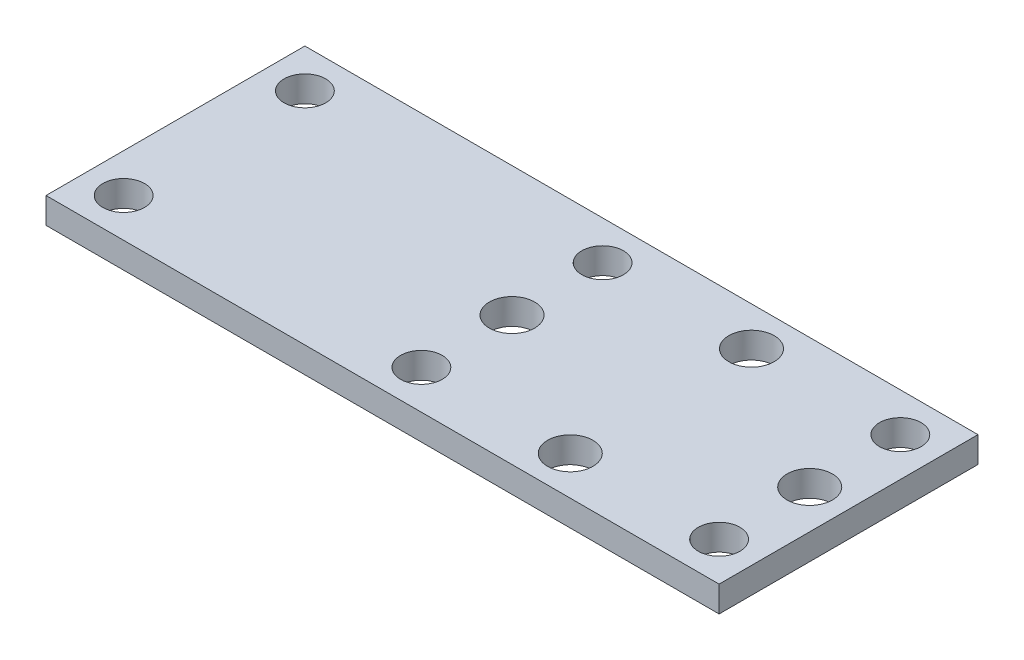
ISO-10303-21;
HEADER;
FILE_DESCRIPTION(('STEP AP214'),'2;1');
FILE_NAME('part.step','',(''),(''),'','','');
FILE_SCHEMA(('AUTOMOTIVE_DESIGN { 1 0 10303 214 1 1 1 1 }'));
ENDSEC;
DATA;
#1=APPLICATION_CONTEXT('core data for automotive mechanical design processes');
#2=APPLICATION_PROTOCOL_DEFINITION('international standard','automotive_design',2000,#1);
#3=PRODUCT_CONTEXT('',#1,'mechanical');
#4=PRODUCT('Part','Part','',(#3));
#5=PRODUCT_RELATED_PRODUCT_CATEGORY('part','',(#4));
#6=PRODUCT_DEFINITION_FORMATION('','',#4);
#7=PRODUCT_DEFINITION_CONTEXT('part definition',#1,'design');
#8=PRODUCT_DEFINITION('design','',#6,#7);
#9=PRODUCT_DEFINITION_SHAPE('','',#8);
#10=(LENGTH_UNIT() NAMED_UNIT(*) SI_UNIT(.MILLI.,.METRE.));
#11=(NAMED_UNIT(*) PLANE_ANGLE_UNIT() SI_UNIT($,.RADIAN.));
#12=(NAMED_UNIT(*) SI_UNIT($,.STERADIAN.) SOLID_ANGLE_UNIT());
#13=UNCERTAINTY_MEASURE_WITH_UNIT(LENGTH_MEASURE(1.E-05),#10,'distance_accuracy_value','');
#14=(GEOMETRIC_REPRESENTATION_CONTEXT(3) GLOBAL_UNCERTAINTY_ASSIGNED_CONTEXT((#13)) GLOBAL_UNIT_ASSIGNED_CONTEXT((#10,
#11,#12)) REPRESENTATION_CONTEXT('',''));
#15=CARTESIAN_POINT('',(0.,0.,0.));
#16=DIRECTION('',(0.,0.,1.));
#17=DIRECTION('',(1.,0.,0.));
#18=AXIS2_PLACEMENT_3D('',#15,#16,#17);
#19=CARTESIAN_POINT('',(0.,-1.5875,0.));
#20=DIRECTION('',(0.,-1.,0.));
#21=DIRECTION('',(0.,0.,-1.));
#22=AXIS2_PLACEMENT_3D('',#19,#20,#21);
#23=PLANE('',#22);
#24=CARTESIAN_POINT('',(0.,-1.5875,0.));
#25=DIRECTION('',(0.,-1.,0.));
#26=DIRECTION('',(0.,0.,-1.));
#27=AXIS2_PLACEMENT_3D('',#24,#25,#26);
#28=CIRCLE('',#27,2.77876);
#29=CARTESIAN_POINT('',(0.,-1.5875,-2.77876));
#30=VERTEX_POINT('',#29);
#31=EDGE_CURVE('E36',#30,#30,#28,.T.);
#32=ORIENTED_EDGE('',*,*,#31,.F.);
#33=EDGE_LOOP('',(#32));
#34=FACE_BOUND('',#33,.T.);
#35=CARTESIAN_POINT('',(18.25625,-1.5875,-11.1125));
#36=DIRECTION('',(0.,-1.,0.));
#37=DIRECTION('',(0.,0.,-1.));
#38=AXIS2_PLACEMENT_3D('',#35,#36,#37);
#39=CIRCLE('',#38,2.77876);
#40=CARTESIAN_POINT('',(18.25625,-1.5875,-13.89126));
#41=VERTEX_POINT('',#40);
#42=EDGE_CURVE('E113',#41,#41,#39,.T.);
#43=ORIENTED_EDGE('',*,*,#42,.F.);
#44=EDGE_LOOP('',(#43));
#45=FACE_BOUND('',#44,.T.);
#46=CARTESIAN_POINT('',(-36.5125,-1.5875,-11.1125));
#47=DIRECTION('',(0.,1.,0.));
#48=DIRECTION('',(0.,0.,1.));
#49=AXIS2_PLACEMENT_3D('',#46,#47,#48);
#50=CIRCLE('',#49,2.5527);
#51=CARTESIAN_POINT('',(-36.5125,-1.5875,-8.5598));
#52=VERTEX_POINT('',#51);
#53=EDGE_CURVE('E135',#52,#52,#50,.T.);
#54=ORIENTED_EDGE('',*,*,#53,.T.);
#55=EDGE_LOOP('',(#54));
#56=FACE_BOUND('',#55,.T.);
#57=CARTESIAN_POINT('',(36.5125,-1.5875,-11.1125));
#58=DIRECTION('',(0.,1.,0.));
#59=DIRECTION('',(0.,0.,1.));
#60=AXIS2_PLACEMENT_3D('',#57,#58,#59);
#61=CIRCLE('',#60,2.5527);
#62=CARTESIAN_POINT('',(36.5125,-1.5875,-8.5598));
#63=VERTEX_POINT('',#62);
#64=EDGE_CURVE('E141',#63,#63,#61,.T.);
#65=ORIENTED_EDGE('',*,*,#64,.T.);
#66=EDGE_LOOP('',(#65));
#67=FACE_BOUND('',#66,.T.);
#68=CARTESIAN_POINT('',(36.5125,-1.5875,11.1125));
#69=DIRECTION('',(0.,1.,0.));
#70=DIRECTION('',(0.,0.,1.));
#71=AXIS2_PLACEMENT_3D('',#68,#69,#70);
#72=CIRCLE('',#71,2.5527);
#73=CARTESIAN_POINT('',(36.5125,-1.5875,13.6652));
#74=VERTEX_POINT('',#73);
#75=EDGE_CURVE('E147',#74,#74,#72,.T.);
#76=ORIENTED_EDGE('',*,*,#75,.T.);
#77=EDGE_LOOP('',(#76));
#78=FACE_BOUND('',#77,.T.);
#79=CARTESIAN_POINT('',(-36.5125,-1.5875,11.1125));
#80=DIRECTION('',(0.,1.,0.));
#81=DIRECTION('',(0.,0.,1.));
#82=AXIS2_PLACEMENT_3D('',#79,#80,#81);
#83=CIRCLE('',#82,2.5527);
#84=CARTESIAN_POINT('',(-36.5125,-1.5875,13.6652));
#85=VERTEX_POINT('',#84);
#86=EDGE_CURVE('E153',#85,#85,#83,.T.);
#87=ORIENTED_EDGE('',*,*,#86,.T.);
#88=EDGE_LOOP('',(#87));
#89=FACE_BOUND('',#88,.T.);
#90=CARTESIAN_POINT('',(0.,-1.5875,11.1125));
#91=DIRECTION('',(0.,1.,0.));
#92=DIRECTION('',(0.,0.,1.));
#93=AXIS2_PLACEMENT_3D('',#90,#91,#92);
#94=CIRCLE('',#93,2.5527);
#95=CARTESIAN_POINT('',(0.,-1.5875,13.6652));
#96=VERTEX_POINT('',#95);
#97=EDGE_CURVE('E159',#96,#96,#94,.T.);
#98=ORIENTED_EDGE('',*,*,#97,.T.);
#99=EDGE_LOOP('',(#98));
#100=FACE_BOUND('',#99,.T.);
#101=CARTESIAN_POINT('',(0.,-1.5875,-11.1125));
#102=DIRECTION('',(0.,1.,0.));
#103=DIRECTION('',(0.,0.,1.));
#104=AXIS2_PLACEMENT_3D('',#101,#102,#103);
#105=CIRCLE('',#104,2.5527);
#106=CARTESIAN_POINT('',(0.,-1.5875,-8.5598));
#107=VERTEX_POINT('',#106);
#108=EDGE_CURVE('E102',#107,#107,#105,.T.);
#109=ORIENTED_EDGE('',*,*,#108,.T.);
#110=EDGE_LOOP('',(#109));
#111=FACE_BOUND('',#110,.T.);
#112=DIRECTION('',(0.,0.,-1.));
#113=VECTOR('',#112,1.);
#114=CARTESIAN_POINT('',(41.275,-1.5875,15.875));
#115=LINE('',#114,#113);
#116=CARTESIAN_POINT('',(41.275,-1.5875,15.875));
#117=VERTEX_POINT('',#116);
#118=CARTESIAN_POINT('',(41.275,-1.5875,-15.875));
#119=VERTEX_POINT('',#118);
#120=EDGE_CURVE('E99',#117,#119,#115,.T.);
#121=ORIENTED_EDGE('',*,*,#120,.F.);
#122=DIRECTION('',(1.,0.,0.));
#123=VECTOR('',#122,1.);
#124=CARTESIAN_POINT('',(-41.275,-1.5875,15.875));
#125=LINE('',#124,#123);
#126=CARTESIAN_POINT('',(-41.275,-1.5875,15.875));
#127=VERTEX_POINT('',#126);
#128=EDGE_CURVE('E74',#127,#117,#125,.T.);
#129=ORIENTED_EDGE('',*,*,#128,.F.);
#130=DIRECTION('',(0.,0.,1.));
#131=VECTOR('',#130,1.);
#132=CARTESIAN_POINT('',(-41.275,-1.5875,15.875));
#133=LINE('',#132,#131);
#134=CARTESIAN_POINT('',(-41.275,-1.5875,-15.875));
#135=VERTEX_POINT('',#134);
#136=EDGE_CURVE('E68',#135,#127,#133,.T.);
#137=ORIENTED_EDGE('',*,*,#136,.F.);
#138=DIRECTION('',(-1.,0.,0.));
#139=VECTOR('',#138,1.);
#140=CARTESIAN_POINT('',(-41.275,-1.5875,-15.875));
#141=LINE('',#140,#139);
#142=EDGE_CURVE('E90',#119,#135,#141,.T.);
#143=ORIENTED_EDGE('',*,*,#142,.F.);
#144=EDGE_LOOP('',(#121,#129,#137,#143));
#145=FACE_BOUND('',#144,.T.);
#146=CARTESIAN_POINT('',(18.25625,-1.5875,11.1125));
#147=DIRECTION('',(0.,-1.,0.));
#148=DIRECTION('',(0.,0.,-1.));
#149=AXIS2_PLACEMENT_3D('',#146,#147,#148);
#150=CIRCLE('',#149,2.77876);
#151=CARTESIAN_POINT('',(18.25625,-1.5875,8.33374));
#152=VERTEX_POINT('',#151);
#153=EDGE_CURVE('E108',#152,#152,#150,.T.);
#154=ORIENTED_EDGE('',*,*,#153,.F.);
#155=EDGE_LOOP('',(#154));
#156=FACE_BOUND('',#155,.T.);
#157=CARTESIAN_POINT('',(36.5125,-1.5875,0.));
#158=DIRECTION('',(0.,-1.,0.));
#159=DIRECTION('',(0.,0.,-1.));
#160=AXIS2_PLACEMENT_3D('',#157,#158,#159);
#161=CIRCLE('',#160,2.77876);
#162=CARTESIAN_POINT('',(36.5125,-1.5875,-2.77876));
#163=VERTEX_POINT('',#162);
#164=EDGE_CURVE('E116',#163,#163,#161,.T.);
#165=ORIENTED_EDGE('',*,*,#164,.F.);
#166=EDGE_LOOP('',(#165));
#167=FACE_BOUND('',#166,.T.);
#168=ADVANCED_FACE('F32',(#34,#45,#56,#67,#78,#89,#100,#111,#145,#156,#167),#23,.T.);
#169=CARTESIAN_POINT('',(41.275,1.5875,15.875));
#170=DIRECTION('',(-1.,0.,0.));
#171=DIRECTION('',(0.,0.,1.));
#172=AXIS2_PLACEMENT_3D('',#169,#170,#171);
#173=PLANE('',#172);
#174=ORIENTED_EDGE('',*,*,#120,.T.);
#175=DIRECTION('',(0.,-1.,0.));
#176=VECTOR('',#175,1.);
#177=CARTESIAN_POINT('',(41.275,1.5875,-15.875));
#178=LINE('',#177,#176);
#179=CARTESIAN_POINT('',(41.275,1.5875,-15.875));
#180=VERTEX_POINT('',#179);
#181=EDGE_CURVE('E11',#180,#119,#178,.T.);
#182=ORIENTED_EDGE('',*,*,#181,.F.);
#183=DIRECTION('',(0.,0.,-1.));
#184=VECTOR('',#183,1.);
#185=CARTESIAN_POINT('',(41.275,1.5875,15.875));
#186=LINE('',#185,#184);
#187=CARTESIAN_POINT('',(41.275,1.5875,15.875));
#188=VERTEX_POINT('',#187);
#189=EDGE_CURVE('E86',#188,#180,#186,.T.);
#190=ORIENTED_EDGE('',*,*,#189,.F.);
#191=DIRECTION('',(0.,-1.,0.));
#192=VECTOR('',#191,1.);
#193=CARTESIAN_POINT('',(41.275,1.5875,15.875));
#194=LINE('',#193,#192);
#195=EDGE_CURVE('E95',#188,#117,#194,.T.);
#196=ORIENTED_EDGE('',*,*,#195,.T.);
#197=EDGE_LOOP('',(#174,#182,#190,#196));
#198=FACE_BOUND('',#197,.T.);
#199=ADVANCED_FACE('F34',(#198),#173,.F.);
#200=CARTESIAN_POINT('',(-41.275,1.5875,-15.875));
#201=DIRECTION('',(0.,0.,1.));
#202=DIRECTION('',(1.,0.,0.));
#203=AXIS2_PLACEMENT_3D('',#200,#201,#202);
#204=PLANE('',#203);
#205=ORIENTED_EDGE('',*,*,#142,.T.);
#206=DIRECTION('',(0.,-1.,0.));
#207=VECTOR('',#206,1.);
#208=CARTESIAN_POINT('',(-41.275,1.5875,-15.875));
#209=LINE('',#208,#207);
#210=CARTESIAN_POINT('',(-41.275,1.5875,-15.875));
#211=VERTEX_POINT('',#210);
#212=EDGE_CURVE('E42',#211,#135,#209,.T.);
#213=ORIENTED_EDGE('',*,*,#212,.F.);
#214=DIRECTION('',(-1.,0.,0.));
#215=VECTOR('',#214,1.);
#216=CARTESIAN_POINT('',(-41.275,1.5875,-15.875));
#217=LINE('',#216,#215);
#218=EDGE_CURVE('E81',#180,#211,#217,.T.);
#219=ORIENTED_EDGE('',*,*,#218,.F.);
#220=ORIENTED_EDGE('',*,*,#181,.T.);
#221=EDGE_LOOP('',(#205,#213,#219,#220));
#222=FACE_BOUND('',#221,.T.);
#223=ADVANCED_FACE('F89',(#222),#204,.F.);
#224=CARTESIAN_POINT('',(-41.275,1.5875,15.875));
#225=DIRECTION('',(1.,0.,0.));
#226=DIRECTION('',(0.,0.,-1.));
#227=AXIS2_PLACEMENT_3D('',#224,#225,#226);
#228=PLANE('',#227);
#229=ORIENTED_EDGE('',*,*,#136,.T.);
#230=DIRECTION('',(0.,-1.,0.));
#231=VECTOR('',#230,1.);
#232=CARTESIAN_POINT('',(-41.275,1.5875,15.875));
#233=LINE('',#232,#231);
#234=CARTESIAN_POINT('',(-41.275,1.5875,15.875));
#235=VERTEX_POINT('',#234);
#236=EDGE_CURVE('E91',#235,#127,#233,.T.);
#237=ORIENTED_EDGE('',*,*,#236,.F.);
#238=DIRECTION('',(0.,0.,1.));
#239=VECTOR('',#238,1.);
#240=CARTESIAN_POINT('',(-41.275,1.5875,15.875));
#241=LINE('',#240,#239);
#242=EDGE_CURVE('E84',#211,#235,#241,.T.);
#243=ORIENTED_EDGE('',*,*,#242,.F.);
#244=ORIENTED_EDGE('',*,*,#212,.T.);
#245=EDGE_LOOP('',(#229,#237,#243,#244));
#246=FACE_BOUND('',#245,.T.);
#247=ADVANCED_FACE('F93',(#246),#228,.F.);
#248=CARTESIAN_POINT('',(-41.275,1.5875,15.875));
#249=DIRECTION('',(0.,0.,-1.));
#250=DIRECTION('',(-1.,0.,0.));
#251=AXIS2_PLACEMENT_3D('',#248,#249,#250);
#252=PLANE('',#251);
#253=ORIENTED_EDGE('',*,*,#128,.T.);
#254=ORIENTED_EDGE('',*,*,#195,.F.);
#255=DIRECTION('',(1.,0.,0.));
#256=VECTOR('',#255,1.);
#257=CARTESIAN_POINT('',(-41.275,1.5875,15.875));
#258=LINE('',#257,#256);
#259=EDGE_CURVE('E51',#235,#188,#258,.T.);
#260=ORIENTED_EDGE('',*,*,#259,.F.);
#261=ORIENTED_EDGE('',*,*,#236,.T.);
#262=EDGE_LOOP('',(#253,#254,#260,#261));
#263=FACE_BOUND('',#262,.T.);
#264=ADVANCED_FACE('F178',(#263),#252,.F.);
#265=CARTESIAN_POINT('',(0.,1.5875,0.));
#266=DIRECTION('',(0.,-1.,0.));
#267=DIRECTION('',(0.,0.,-1.));
#268=AXIS2_PLACEMENT_3D('',#265,#266,#267);
#269=PLANE('',#268);
#270=CARTESIAN_POINT('',(0.,1.5875,0.));
#271=DIRECTION('',(0.,1.,0.));
#272=DIRECTION('',(0.,0.,1.));
#273=AXIS2_PLACEMENT_3D('',#270,#271,#272);
#274=CIRCLE('',#273,2.77876);
#275=CARTESIAN_POINT('',(0.,1.5875,2.77876));
#276=VERTEX_POINT('',#275);
#277=EDGE_CURVE('E128',#276,#276,#274,.T.);
#278=ORIENTED_EDGE('',*,*,#277,.F.);
#279=EDGE_LOOP('',(#278));
#280=FACE_BOUND('',#279,.T.);
#281=CARTESIAN_POINT('',(36.5125,1.5875,0.));
#282=DIRECTION('',(0.,1.,0.));
#283=DIRECTION('',(0.,0.,1.));
#284=AXIS2_PLACEMENT_3D('',#281,#282,#283);
#285=CIRCLE('',#284,2.77876);
#286=CARTESIAN_POINT('',(36.5125,1.5875,2.77876));
#287=VERTEX_POINT('',#286);
#288=EDGE_CURVE('E118',#287,#287,#285,.T.);
#289=ORIENTED_EDGE('',*,*,#288,.F.);
#290=EDGE_LOOP('',(#289));
#291=FACE_BOUND('',#290,.T.);
#292=CARTESIAN_POINT('',(18.25625,1.5875,-11.1125));
#293=DIRECTION('',(0.,1.,0.));
#294=DIRECTION('',(0.,0.,1.));
#295=AXIS2_PLACEMENT_3D('',#292,#293,#294);
#296=CIRCLE('',#295,2.77876);
#297=CARTESIAN_POINT('',(18.25625,1.5875,-8.33374));
#298=VERTEX_POINT('',#297);
#299=EDGE_CURVE('E115',#298,#298,#296,.T.);
#300=ORIENTED_EDGE('',*,*,#299,.F.);
#301=EDGE_LOOP('',(#300));
#302=FACE_BOUND('',#301,.T.);
#303=CARTESIAN_POINT('',(18.25625,1.5875,11.1125));
#304=DIRECTION('',(0.,1.,0.));
#305=DIRECTION('',(0.,0.,1.));
#306=AXIS2_PLACEMENT_3D('',#303,#304,#305);
#307=CIRCLE('',#306,2.77876);
#308=CARTESIAN_POINT('',(18.25625,1.5875,13.89126));
#309=VERTEX_POINT('',#308);
#310=EDGE_CURVE('E112',#309,#309,#307,.T.);
#311=ORIENTED_EDGE('',*,*,#310,.F.);
#312=EDGE_LOOP('',(#311));
#313=FACE_BOUND('',#312,.T.);
#314=CARTESIAN_POINT('',(-36.5125,1.5875,-11.1125));
#315=DIRECTION('',(0.,1.,0.));
#316=DIRECTION('',(0.,0.,1.));
#317=AXIS2_PLACEMENT_3D('',#314,#315,#316);
#318=CIRCLE('',#317,2.5527);
#319=CARTESIAN_POINT('',(-36.5125,1.5875,-8.5598));
#320=VERTEX_POINT('',#319);
#321=EDGE_CURVE('E111',#320,#320,#318,.T.);
#322=ORIENTED_EDGE('',*,*,#321,.F.);
#323=EDGE_LOOP('',(#322));
#324=FACE_BOUND('',#323,.T.);
#325=CARTESIAN_POINT('',(36.5125,1.5875,-11.1125));
#326=DIRECTION('',(0.,1.,0.));
#327=DIRECTION('',(0.,0.,1.));
#328=AXIS2_PLACEMENT_3D('',#325,#326,#327);
#329=CIRCLE('',#328,2.5527);
#330=CARTESIAN_POINT('',(36.5125,1.5875,-8.5598));
#331=VERTEX_POINT('',#330);
#332=EDGE_CURVE('E138',#331,#331,#329,.T.);
#333=ORIENTED_EDGE('',*,*,#332,.F.);
#334=EDGE_LOOP('',(#333));
#335=FACE_BOUND('',#334,.T.);
#336=CARTESIAN_POINT('',(36.5125,1.5875,11.1125));
#337=DIRECTION('',(0.,1.,0.));
#338=DIRECTION('',(0.,0.,1.));
#339=AXIS2_PLACEMENT_3D('',#336,#337,#338);
#340=CIRCLE('',#339,2.5527);
#341=CARTESIAN_POINT('',(36.5125,1.5875,13.6652));
#342=VERTEX_POINT('',#341);
#343=EDGE_CURVE('E144',#342,#342,#340,.T.);
#344=ORIENTED_EDGE('',*,*,#343,.F.);
#345=EDGE_LOOP('',(#344));
#346=FACE_BOUND('',#345,.T.);
#347=CARTESIAN_POINT('',(-36.5125,1.5875,11.1125));
#348=DIRECTION('',(0.,1.,0.));
#349=DIRECTION('',(0.,0.,1.));
#350=AXIS2_PLACEMENT_3D('',#347,#348,#349);
#351=CIRCLE('',#350,2.5527);
#352=CARTESIAN_POINT('',(-36.5125,1.5875,13.6652));
#353=VERTEX_POINT('',#352);
#354=EDGE_CURVE('E150',#353,#353,#351,.T.);
#355=ORIENTED_EDGE('',*,*,#354,.F.);
#356=EDGE_LOOP('',(#355));
#357=FACE_BOUND('',#356,.T.);
#358=CARTESIAN_POINT('',(0.,1.5875,11.1125));
#359=DIRECTION('',(0.,1.,0.));
#360=DIRECTION('',(0.,0.,1.));
#361=AXIS2_PLACEMENT_3D('',#358,#359,#360);
#362=CIRCLE('',#361,2.5527);
#363=CARTESIAN_POINT('',(0.,1.5875,13.6652));
#364=VERTEX_POINT('',#363);
#365=EDGE_CURVE('E156',#364,#364,#362,.T.);
#366=ORIENTED_EDGE('',*,*,#365,.F.);
#367=EDGE_LOOP('',(#366));
#368=FACE_BOUND('',#367,.T.);
#369=CARTESIAN_POINT('',(0.,1.5875,-11.1125));
#370=DIRECTION('',(0.,1.,0.));
#371=DIRECTION('',(0.,0.,1.));
#372=AXIS2_PLACEMENT_3D('',#369,#370,#371);
#373=CIRCLE('',#372,2.5527);
#374=CARTESIAN_POINT('',(0.,1.5875,-8.5598));
#375=VERTEX_POINT('',#374);
#376=EDGE_CURVE('E162',#375,#375,#373,.T.);
#377=ORIENTED_EDGE('',*,*,#376,.F.);
#378=EDGE_LOOP('',(#377));
#379=FACE_BOUND('',#378,.T.);
#380=ORIENTED_EDGE('',*,*,#189,.T.);
#381=ORIENTED_EDGE('',*,*,#218,.T.);
#382=ORIENTED_EDGE('',*,*,#242,.T.);
#383=ORIENTED_EDGE('',*,*,#259,.T.);
#384=EDGE_LOOP('',(#380,#381,#382,#383));
#385=FACE_BOUND('',#384,.T.);
#386=ADVANCED_FACE('F82',(#280,#291,#302,#313,#324,#335,#346,#357,#368,#379,#385),#269,.F.);
#387=CARTESIAN_POINT('',(0.,1.5875,-11.1125));
#388=DIRECTION('',(0.,1.,0.));
#389=DIRECTION('',(0.,0.,1.));
#390=AXIS2_PLACEMENT_3D('',#387,#388,#389);
#391=CYLINDRICAL_SURFACE('',#390,2.5527);
#392=ORIENTED_EDGE('',*,*,#108,.F.);
#393=EDGE_LOOP('',(#392));
#394=FACE_BOUND('',#393,.T.);
#395=ORIENTED_EDGE('',*,*,#376,.T.);
#396=EDGE_LOOP('',(#395));
#397=FACE_BOUND('',#396,.T.);
#398=ADVANCED_FACE('F170',(#394,#397),#391,.F.);
#399=CARTESIAN_POINT('',(0.,1.5875,11.1125));
#400=DIRECTION('',(0.,1.,0.));
#401=DIRECTION('',(0.,0.,1.));
#402=AXIS2_PLACEMENT_3D('',#399,#400,#401);
#403=CYLINDRICAL_SURFACE('',#402,2.5527);
#404=ORIENTED_EDGE('',*,*,#97,.F.);
#405=EDGE_LOOP('',(#404));
#406=FACE_BOUND('',#405,.T.);
#407=ORIENTED_EDGE('',*,*,#365,.T.);
#408=EDGE_LOOP('',(#407));
#409=FACE_BOUND('',#408,.T.);
#410=ADVANCED_FACE('F173',(#406,#409),#403,.F.);
#411=CARTESIAN_POINT('',(-36.5125,1.5875,11.1125));
#412=DIRECTION('',(0.,1.,0.));
#413=DIRECTION('',(0.,0.,1.));
#414=AXIS2_PLACEMENT_3D('',#411,#412,#413);
#415=CYLINDRICAL_SURFACE('',#414,2.5527);
#416=ORIENTED_EDGE('',*,*,#86,.F.);
#417=EDGE_LOOP('',(#416));
#418=FACE_BOUND('',#417,.T.);
#419=ORIENTED_EDGE('',*,*,#354,.T.);
#420=EDGE_LOOP('',(#419));
#421=FACE_BOUND('',#420,.T.);
#422=ADVANCED_FACE('F227',(#418,#421),#415,.F.);
#423=CARTESIAN_POINT('',(36.5125,1.5875,11.1125));
#424=DIRECTION('',(0.,1.,0.));
#425=DIRECTION('',(0.,0.,1.));
#426=AXIS2_PLACEMENT_3D('',#423,#424,#425);
#427=CYLINDRICAL_SURFACE('',#426,2.5527);
#428=ORIENTED_EDGE('',*,*,#75,.F.);
#429=EDGE_LOOP('',(#428));
#430=FACE_BOUND('',#429,.T.);
#431=ORIENTED_EDGE('',*,*,#343,.T.);
#432=EDGE_LOOP('',(#431));
#433=FACE_BOUND('',#432,.T.);
#434=ADVANCED_FACE('F237',(#430,#433),#427,.F.);
#435=CARTESIAN_POINT('',(36.5125,1.5875,-11.1125));
#436=DIRECTION('',(0.,1.,0.));
#437=DIRECTION('',(0.,0.,1.));
#438=AXIS2_PLACEMENT_3D('',#435,#436,#437);
#439=CYLINDRICAL_SURFACE('',#438,2.5527);
#440=ORIENTED_EDGE('',*,*,#64,.F.);
#441=EDGE_LOOP('',(#440));
#442=FACE_BOUND('',#441,.T.);
#443=ORIENTED_EDGE('',*,*,#332,.T.);
#444=EDGE_LOOP('',(#443));
#445=FACE_BOUND('',#444,.T.);
#446=ADVANCED_FACE('F247',(#442,#445),#439,.F.);
#447=CARTESIAN_POINT('',(-36.5125,1.5875,-11.1125));
#448=DIRECTION('',(0.,1.,0.));
#449=DIRECTION('',(0.,0.,1.));
#450=AXIS2_PLACEMENT_3D('',#447,#448,#449);
#451=CYLINDRICAL_SURFACE('',#450,2.5527);
#452=ORIENTED_EDGE('',*,*,#53,.F.);
#453=EDGE_LOOP('',(#452));
#454=FACE_BOUND('',#453,.T.);
#455=ORIENTED_EDGE('',*,*,#321,.T.);
#456=EDGE_LOOP('',(#455));
#457=FACE_BOUND('',#456,.T.);
#458=ADVANCED_FACE('F257',(#454,#457),#451,.F.);
#459=CARTESIAN_POINT('',(18.25625,1.5875,11.1125));
#460=DIRECTION('',(0.,1.,0.));
#461=DIRECTION('',(0.,0.,1.));
#462=AXIS2_PLACEMENT_3D('',#459,#460,#461);
#463=CYLINDRICAL_SURFACE('',#462,2.77876);
#464=ORIENTED_EDGE('',*,*,#153,.T.);
#465=EDGE_LOOP('',(#464));
#466=FACE_BOUND('',#465,.T.);
#467=ORIENTED_EDGE('',*,*,#310,.T.);
#468=EDGE_LOOP('',(#467));
#469=FACE_BOUND('',#468,.T.);
#470=ADVANCED_FACE('F266',(#466,#469),#463,.F.);
#471=CARTESIAN_POINT('',(18.25625,1.5875,-11.1125));
#472=DIRECTION('',(0.,1.,0.));
#473=DIRECTION('',(0.,0.,1.));
#474=AXIS2_PLACEMENT_3D('',#471,#472,#473);
#475=CYLINDRICAL_SURFACE('',#474,2.77876);
#476=ORIENTED_EDGE('',*,*,#42,.T.);
#477=EDGE_LOOP('',(#476));
#478=FACE_BOUND('',#477,.T.);
#479=ORIENTED_EDGE('',*,*,#299,.T.);
#480=EDGE_LOOP('',(#479));
#481=FACE_BOUND('',#480,.T.);
#482=ADVANCED_FACE('F284',(#478,#481),#475,.F.);
#483=CARTESIAN_POINT('',(36.5125,1.5875,0.));
#484=DIRECTION('',(0.,1.,0.));
#485=DIRECTION('',(0.,0.,1.));
#486=AXIS2_PLACEMENT_3D('',#483,#484,#485);
#487=CYLINDRICAL_SURFACE('',#486,2.77876);
#488=ORIENTED_EDGE('',*,*,#164,.T.);
#489=EDGE_LOOP('',(#488));
#490=FACE_BOUND('',#489,.T.);
#491=ORIENTED_EDGE('',*,*,#288,.T.);
#492=EDGE_LOOP('',(#491));
#493=FACE_BOUND('',#492,.T.);
#494=ADVANCED_FACE('F294',(#490,#493),#487,.F.);
#495=CARTESIAN_POINT('',(0.,1.5875,0.));
#496=DIRECTION('',(0.,1.,0.));
#497=DIRECTION('',(0.,0.,1.));
#498=AXIS2_PLACEMENT_3D('',#495,#496,#497);
#499=CYLINDRICAL_SURFACE('',#498,2.77876);
#500=ORIENTED_EDGE('',*,*,#31,.T.);
#501=EDGE_LOOP('',(#500));
#502=FACE_BOUND('',#501,.T.);
#503=ORIENTED_EDGE('',*,*,#277,.T.);
#504=EDGE_LOOP('',(#503));
#505=FACE_BOUND('',#504,.T.);
#506=ADVANCED_FACE('F304',(#502,#505),#499,.F.);
#507=CLOSED_SHELL('',(#168,#199,#223,#247,#264,#386,#398,#410,#422,#434,#446,#458,#470,#482,
#494,#506));
#508=MANIFOLD_SOLID_BREP('B2',#507);
#509=ADVANCED_BREP_SHAPE_REPRESENTATION('',(#18,#508),#14);
#510=SHAPE_DEFINITION_REPRESENTATION(#9,#509);
ENDSEC;
END-ISO-10303-21;
